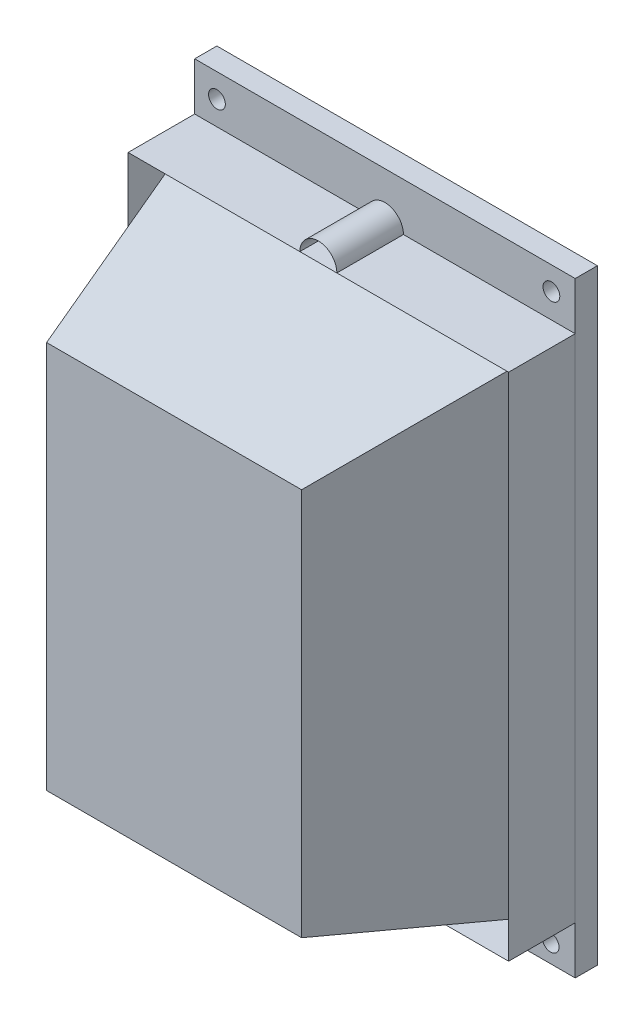
ISO-10303-21;
HEADER;
FILE_DESCRIPTION(('STEP AP214'),'2;1');
FILE_NAME('part.step','',(''),(''),'','','');
FILE_SCHEMA(('AUTOMOTIVE_DESIGN { 1 0 10303 214 1 1 1 1 }'));
ENDSEC;
DATA;
#1=APPLICATION_CONTEXT('core data for automotive mechanical design processes');
#2=APPLICATION_PROTOCOL_DEFINITION('international standard','automotive_design',2000,#1);
#3=PRODUCT_CONTEXT('',#1,'mechanical');
#4=PRODUCT('Part','Part','',(#3));
#5=PRODUCT_RELATED_PRODUCT_CATEGORY('part','',(#4));
#6=PRODUCT_DEFINITION_FORMATION('','',#4);
#7=PRODUCT_DEFINITION_CONTEXT('part definition',#1,'design');
#8=PRODUCT_DEFINITION('design','',#6,#7);
#9=PRODUCT_DEFINITION_SHAPE('','',#8);
#10=(LENGTH_UNIT() NAMED_UNIT(*) SI_UNIT(.MILLI.,.METRE.));
#11=(NAMED_UNIT(*) PLANE_ANGLE_UNIT() SI_UNIT($,.RADIAN.));
#12=(NAMED_UNIT(*) SI_UNIT($,.STERADIAN.) SOLID_ANGLE_UNIT());
#13=UNCERTAINTY_MEASURE_WITH_UNIT(LENGTH_MEASURE(1.E-05),#10,'distance_accuracy_value','');
#14=(GEOMETRIC_REPRESENTATION_CONTEXT(3) GLOBAL_UNCERTAINTY_ASSIGNED_CONTEXT((#13)) GLOBAL_UNIT_ASSIGNED_CONTEXT((#10,
#11,#12)) REPRESENTATION_CONTEXT('',''));
#15=CARTESIAN_POINT('',(0.,0.,0.));
#16=DIRECTION('',(0.,0.,1.));
#17=DIRECTION('',(1.,0.,0.));
#18=AXIS2_PLACEMENT_3D('',#15,#16,#17);
#19=CARTESIAN_POINT('',(-4.28663117251557,-5.74678858480512,0.5));
#20=DIRECTION('',(-1.,0.,0.));
#21=DIRECTION('',(0.,0.,1.));
#22=AXIS2_PLACEMENT_3D('',#19,#20,#21);
#23=PLANE('',#22);
#24=DIRECTION('',(0.,-1.,0.));
#25=VECTOR('',#24,1.);
#26=CARTESIAN_POINT('',(-4.28663117251557,-5.74678858480512,2.));
#27=LINE('',#26,#25);
#28=CARTESIAN_POINT('',(-4.28663117251557,5.74678858480512,2.));
#29=VERTEX_POINT('',#28);
#30=CARTESIAN_POINT('',(-4.28663117251557,-5.74678858480512,2.));
#31=VERTEX_POINT('',#30);
#32=EDGE_CURVE('E61',#29,#31,#27,.T.);
#33=ORIENTED_EDGE('',*,*,#32,.F.);
#34=DIRECTION('',(0.,0.,1.));
#35=VECTOR('',#34,1.);
#36=CARTESIAN_POINT('',(-4.28663117251557,5.74678858480512,0.5));
#37=LINE('',#36,#35);
#38=CARTESIAN_POINT('',(-4.28663117251557,5.74678858480512,0.5));
#39=VERTEX_POINT('',#38);
#40=EDGE_CURVE('E96',#39,#29,#37,.T.);
#41=ORIENTED_EDGE('',*,*,#40,.F.);
#42=DIRECTION('',(0.,-1.,0.));
#43=VECTOR('',#42,1.);
#44=CARTESIAN_POINT('',(-4.28663117251557,-5.74678858480512,0.5));
#45=LINE('',#44,#43);
#46=CARTESIAN_POINT('',(-4.28663117251557,-5.74678858480512,0.5));
#47=VERTEX_POINT('',#46);
#48=EDGE_CURVE('E12',#39,#47,#45,.T.);
#49=ORIENTED_EDGE('',*,*,#48,.T.);
#50=DIRECTION('',(0.,0.,1.));
#51=VECTOR('',#50,1.);
#52=CARTESIAN_POINT('',(-4.28663117251557,-5.74678858480512,0.5));
#53=LINE('',#52,#51);
#54=EDGE_CURVE('E70',#47,#31,#53,.T.);
#55=ORIENTED_EDGE('',*,*,#54,.T.);
#56=EDGE_LOOP('',(#33,#41,#49,#55));
#57=FACE_BOUND('',#56,.T.);
#58=ADVANCED_FACE('F53',(#57),#23,.T.);
#59=CARTESIAN_POINT('',(4.28663117251557,-5.74678858480512,0.5));
#60=DIRECTION('',(0.,-1.,0.));
#61=DIRECTION('',(0.,0.,-1.));
#62=AXIS2_PLACEMENT_3D('',#59,#60,#61);
#63=PLANE('',#62);
#64=DIRECTION('',(1.,0.,0.));
#65=VECTOR('',#64,1.);
#66=CARTESIAN_POINT('',(4.28663117251557,-5.74678858480512,2.));
#67=LINE('',#66,#65);
#68=CARTESIAN_POINT('',(4.28663117251557,-5.74678858480512,2.));
#69=VERTEX_POINT('',#68);
#70=EDGE_CURVE('E113',#31,#69,#67,.T.);
#71=ORIENTED_EDGE('',*,*,#70,.F.);
#72=ORIENTED_EDGE('',*,*,#54,.F.);
#73=DIRECTION('',(1.,0.,0.));
#74=VECTOR('',#73,1.);
#75=CARTESIAN_POINT('',(4.28663117251557,-5.74678858480512,0.5));
#76=LINE('',#75,#74);
#77=CARTESIAN_POINT('',(4.28663117251557,-5.74678858480512,0.5));
#78=VERTEX_POINT('',#77);
#79=EDGE_CURVE('E114',#47,#78,#76,.T.);
#80=ORIENTED_EDGE('',*,*,#79,.T.);
#81=DIRECTION('',(0.,0.,1.));
#82=VECTOR('',#81,1.);
#83=CARTESIAN_POINT('',(4.28663117251557,-5.74678858480512,0.5));
#84=LINE('',#83,#82);
#85=EDGE_CURVE('E84',#78,#69,#84,.T.);
#86=ORIENTED_EDGE('',*,*,#85,.T.);
#87=EDGE_LOOP('',(#71,#72,#80,#86));
#88=FACE_BOUND('',#87,.T.);
#89=ADVANCED_FACE('F140',(#88),#63,.T.);
#90=CARTESIAN_POINT('',(4.28663117251557,-5.74678858480512,0.5));
#91=DIRECTION('',(1.,0.,0.));
#92=DIRECTION('',(0.,0.,-1.));
#93=AXIS2_PLACEMENT_3D('',#90,#91,#92);
#94=PLANE('',#93);
#95=DIRECTION('',(0.,1.,0.));
#96=VECTOR('',#95,1.);
#97=CARTESIAN_POINT('',(4.28663117251557,-5.74678858480512,2.));
#98=LINE('',#97,#96);
#99=CARTESIAN_POINT('',(4.28663117251557,5.74678858480512,2.));
#100=VERTEX_POINT('',#99);
#101=EDGE_CURVE('E100',#69,#100,#98,.T.);
#102=ORIENTED_EDGE('',*,*,#101,.F.);
#103=ORIENTED_EDGE('',*,*,#85,.F.);
#104=DIRECTION('',(0.,1.,0.));
#105=VECTOR('',#104,1.);
#106=CARTESIAN_POINT('',(4.28663117251557,-5.74678858480512,0.5));
#107=LINE('',#106,#105);
#108=CARTESIAN_POINT('',(4.28663117251557,5.74678858480512,0.5));
#109=VERTEX_POINT('',#108);
#110=EDGE_CURVE('E111',#78,#109,#107,.T.);
#111=ORIENTED_EDGE('',*,*,#110,.T.);
#112=DIRECTION('',(0.,0.,1.));
#113=VECTOR('',#112,1.);
#114=CARTESIAN_POINT('',(4.28663117251557,5.74678858480512,0.5));
#115=LINE('',#114,#113);
#116=EDGE_CURVE('E55',#109,#100,#115,.T.);
#117=ORIENTED_EDGE('',*,*,#116,.T.);
#118=EDGE_LOOP('',(#102,#103,#111,#117));
#119=FACE_BOUND('',#118,.T.);
#120=ADVANCED_FACE('F142',(#119),#94,.T.);
#121=CARTESIAN_POINT('',(4.28663117251557,5.74678858480512,0.5));
#122=DIRECTION('',(0.,1.,0.));
#123=DIRECTION('',(0.,0.,1.));
#124=AXIS2_PLACEMENT_3D('',#121,#122,#123);
#125=PLANE('',#124);
#126=DIRECTION('',(-1.,0.,0.));
#127=VECTOR('',#126,1.);
#128=CARTESIAN_POINT('',(4.28663117251557,5.74678858480512,2.));
#129=LINE('',#128,#127);
#130=EDGE_CURVE('E109',#100,#29,#129,.T.);
#131=ORIENTED_EDGE('',*,*,#130,.F.);
#132=ORIENTED_EDGE('',*,*,#116,.F.);
#133=DIRECTION('',(-1.,0.,0.));
#134=VECTOR('',#133,1.);
#135=CARTESIAN_POINT('',(4.28663117251557,5.74678858480512,0.5));
#136=LINE('',#135,#134);
#137=EDGE_CURVE('E101',#109,#39,#136,.T.);
#138=ORIENTED_EDGE('',*,*,#137,.T.);
#139=ORIENTED_EDGE('',*,*,#40,.T.);
#140=EDGE_LOOP('',(#131,#132,#138,#139));
#141=FACE_BOUND('',#140,.T.);
#142=ADVANCED_FACE('F102',(#141),#125,.T.);
#143=OPEN_SHELL('',(#58,#89,#120,#142));
#144=SHELL_BASED_SURFACE_MODEL('B2',(#143));
#145=CARTESIAN_POINT('',(0.,5.74678858480512,0.5));
#146=DIRECTION('',(0.,0.,1.));
#147=DIRECTION('',(1.,0.,0.));
#148=AXIS2_PLACEMENT_3D('',#145,#146,#147);
#149=CYLINDRICAL_SURFACE('',#148,0.416715703548174);
#150=CARTESIAN_POINT('',(0.,5.74678858480512,2.));
#151=DIRECTION('',(0.,0.,1.));
#152=DIRECTION('',(1.,0.,0.));
#153=AXIS2_PLACEMENT_3D('',#150,#151,#152);
#154=CIRCLE('',#153,0.416715703548174);
#155=CARTESIAN_POINT('',(0.416715703548174,5.74678858480512,2.));
#156=VERTEX_POINT('',#155);
#157=CARTESIAN_POINT('',(-0.416715703548174,5.74678858480512,2.));
#158=VERTEX_POINT('',#157);
#159=EDGE_CURVE('E223',#156,#158,#154,.T.);
#160=ORIENTED_EDGE('',*,*,#159,.F.);
#161=DIRECTION('',(0.,0.,1.));
#162=VECTOR('',#161,1.);
#163=CARTESIAN_POINT('',(0.416715703548174,5.74678858480512,0.5));
#164=LINE('',#163,#162);
#165=CARTESIAN_POINT('',(0.416715703548174,5.74678858480512,0.5));
#166=VERTEX_POINT('',#165);
#167=EDGE_CURVE('E205',#166,#156,#164,.T.);
#168=ORIENTED_EDGE('',*,*,#167,.F.);
#169=CARTESIAN_POINT('',(0.,5.74678858480512,0.5));
#170=DIRECTION('',(0.,0.,1.));
#171=DIRECTION('',(1.,0.,0.));
#172=AXIS2_PLACEMENT_3D('',#169,#170,#171);
#173=CIRCLE('',#172,0.416715703548174);
#174=CARTESIAN_POINT('',(-0.416715703548174,5.74678858480512,0.5));
#175=VERTEX_POINT('',#174);
#176=EDGE_CURVE('E211',#166,#175,#173,.T.);
#177=ORIENTED_EDGE('',*,*,#176,.T.);
#178=DIRECTION('',(0.,0.,1.));
#179=VECTOR('',#178,1.);
#180=CARTESIAN_POINT('',(-0.416715703548174,5.74678858480512,0.5));
#181=LINE('',#180,#179);
#182=EDGE_CURVE('E51',#175,#158,#181,.T.);
#183=ORIENTED_EDGE('',*,*,#182,.T.);
#184=EDGE_LOOP('',(#160,#168,#177,#183));
#185=FACE_BOUND('',#184,.T.);
#186=ADVANCED_FACE('F204',(#185),#149,.T.);
#187=OPEN_SHELL('',(#186));
#188=SHELL_BASED_SURFACE_MODEL('B6',(#187));
#189=CARTESIAN_POINT('',(0.,-5.74678858480512,0.5));
#190=DIRECTION('',(0.,0.,1.));
#191=DIRECTION('',(1.,0.,0.));
#192=AXIS2_PLACEMENT_3D('',#189,#190,#191);
#193=CYLINDRICAL_SURFACE('',#192,0.41625);
#194=CARTESIAN_POINT('',(0.,-5.74678858480512,2.));
#195=DIRECTION('',(0.,0.,1.));
#196=DIRECTION('',(1.,0.,0.));
#197=AXIS2_PLACEMENT_3D('',#194,#195,#196);
#198=CIRCLE('',#197,0.41625);
#199=CARTESIAN_POINT('',(-0.41625,-5.74678858480512,2.));
#200=VERTEX_POINT('',#199);
#201=CARTESIAN_POINT('',(0.41625,-5.74678858480512,2.));
#202=VERTEX_POINT('',#201);
#203=EDGE_CURVE('E279',#200,#202,#198,.T.);
#204=ORIENTED_EDGE('',*,*,#203,.F.);
#205=DIRECTION('',(0.,0.,1.));
#206=VECTOR('',#205,1.);
#207=CARTESIAN_POINT('',(-0.41625,-5.74678858480512,0.5));
#208=LINE('',#207,#206);
#209=CARTESIAN_POINT('',(-0.41625,-5.74678858480512,0.5));
#210=VERTEX_POINT('',#209);
#211=EDGE_CURVE('E261',#210,#200,#208,.T.);
#212=ORIENTED_EDGE('',*,*,#211,.F.);
#213=CARTESIAN_POINT('',(0.,-5.74678858480512,0.5));
#214=DIRECTION('',(0.,0.,1.));
#215=DIRECTION('',(1.,0.,0.));
#216=AXIS2_PLACEMENT_3D('',#213,#214,#215);
#217=CIRCLE('',#216,0.41625);
#218=CARTESIAN_POINT('',(0.41625,-5.74678858480512,0.5));
#219=VERTEX_POINT('',#218);
#220=EDGE_CURVE('E267',#210,#219,#217,.T.);
#221=ORIENTED_EDGE('',*,*,#220,.T.);
#222=DIRECTION('',(0.,0.,1.));
#223=VECTOR('',#222,1.);
#224=CARTESIAN_POINT('',(0.41625,-5.74678858480512,0.5));
#225=LINE('',#224,#223);
#226=EDGE_CURVE('E202',#219,#202,#225,.T.);
#227=ORIENTED_EDGE('',*,*,#226,.T.);
#228=EDGE_LOOP('',(#204,#212,#221,#227));
#229=FACE_BOUND('',#228,.T.);
#230=ADVANCED_FACE('F260',(#229),#193,.T.);
#231=OPEN_SHELL('',(#230));
#232=SHELL_BASED_SURFACE_MODEL('B45',(#231));
#233=CARTESIAN_POINT('',(-4.28663117251557,-6.82361696849417,0.5));
#234=DIRECTION('',(1.,0.,0.));
#235=DIRECTION('',(0.,0.,-1.));
#236=AXIS2_PLACEMENT_3D('',#233,#234,#235);
#237=PLANE('',#236);
#238=DIRECTION('',(0.,-1.,0.));
#239=VECTOR('',#238,1.);
#240=CARTESIAN_POINT('',(-4.28663117251557,-6.82361696849417,0.));
#241=LINE('',#240,#239);
#242=CARTESIAN_POINT('',(-4.28663117251557,6.82361696849417,0.));
#243=VERTEX_POINT('',#242);
#244=CARTESIAN_POINT('',(-4.28663117251557,-6.82361696849417,0.));
#245=VERTEX_POINT('',#244);
#246=EDGE_CURVE('E389',#243,#245,#241,.T.);
#247=ORIENTED_EDGE('',*,*,#246,.T.);
#248=DIRECTION('',(0.,0.,-1.));
#249=VECTOR('',#248,1.);
#250=CARTESIAN_POINT('',(-4.28663117251557,-6.82361696849417,0.5));
#251=LINE('',#250,#249);
#252=CARTESIAN_POINT('',(-4.28663117251557,-6.82361696849417,0.5));
#253=VERTEX_POINT('',#252);
#254=EDGE_CURVE('E258',#253,#245,#251,.T.);
#255=ORIENTED_EDGE('',*,*,#254,.F.);
#256=DIRECTION('',(0.,-1.,0.));
#257=VECTOR('',#256,1.);
#258=CARTESIAN_POINT('',(-4.28663117251557,-6.82361696849417,0.5));
#259=LINE('',#258,#257);
#260=CARTESIAN_POINT('',(-4.28663117251557,6.82361696849417,0.5));
#261=VERTEX_POINT('',#260);
#262=EDGE_CURVE('E403',#261,#253,#259,.T.);
#263=ORIENTED_EDGE('',*,*,#262,.F.);
#264=DIRECTION('',(0.,0.,-1.));
#265=VECTOR('',#264,1.);
#266=CARTESIAN_POINT('',(-4.28663117251557,6.82361696849417,0.5));
#267=LINE('',#266,#265);
#268=EDGE_CURVE('E413',#261,#243,#267,.T.);
#269=ORIENTED_EDGE('',*,*,#268,.T.);
#270=EDGE_LOOP('',(#247,#255,#263,#269));
#271=FACE_BOUND('',#270,.T.);
#272=ADVANCED_FACE('F307',(#271),#237,.F.);
#273=CARTESIAN_POINT('',(4.28663117251557,-6.82361696849417,0.5));
#274=DIRECTION('',(0.,1.,0.));
#275=DIRECTION('',(0.,0.,1.));
#276=AXIS2_PLACEMENT_3D('',#273,#274,#275);
#277=PLANE('',#276);
#278=DIRECTION('',(1.,0.,0.));
#279=VECTOR('',#278,1.);
#280=CARTESIAN_POINT('',(4.28663117251557,-6.82361696849417,0.));
#281=LINE('',#280,#279);
#282=CARTESIAN_POINT('',(4.28663117251557,-6.82361696849417,0.));
#283=VERTEX_POINT('',#282);
#284=EDGE_CURVE('E416',#245,#283,#281,.T.);
#285=ORIENTED_EDGE('',*,*,#284,.T.);
#286=DIRECTION('',(0.,0.,-1.));
#287=VECTOR('',#286,1.);
#288=CARTESIAN_POINT('',(4.28663117251557,-6.82361696849417,0.5));
#289=LINE('',#288,#287);
#290=CARTESIAN_POINT('',(4.28663117251557,-6.82361696849417,0.5));
#291=VERTEX_POINT('',#290);
#292=EDGE_CURVE('E314',#291,#283,#289,.T.);
#293=ORIENTED_EDGE('',*,*,#292,.F.);
#294=DIRECTION('',(1.,0.,0.));
#295=VECTOR('',#294,1.);
#296=CARTESIAN_POINT('',(4.28663117251557,-6.82361696849417,0.5));
#297=LINE('',#296,#295);
#298=EDGE_CURVE('E406',#253,#291,#297,.T.);
#299=ORIENTED_EDGE('',*,*,#298,.F.);
#300=ORIENTED_EDGE('',*,*,#254,.T.);
#301=EDGE_LOOP('',(#285,#293,#299,#300));
#302=FACE_BOUND('',#301,.T.);
#303=ADVANCED_FACE('F444',(#302),#277,.F.);
#304=CARTESIAN_POINT('',(4.28663117251557,-6.82361696849417,0.5));
#305=DIRECTION('',(-1.,0.,0.));
#306=DIRECTION('',(0.,0.,1.));
#307=AXIS2_PLACEMENT_3D('',#304,#305,#306);
#308=PLANE('',#307);
#309=DIRECTION('',(0.,1.,0.));
#310=VECTOR('',#309,1.);
#311=CARTESIAN_POINT('',(4.28663117251557,-6.82361696849417,0.));
#312=LINE('',#311,#310);
#313=CARTESIAN_POINT('',(4.28663117251557,6.82361696849417,0.));
#314=VERTEX_POINT('',#313);
#315=EDGE_CURVE('E418',#283,#314,#312,.T.);
#316=ORIENTED_EDGE('',*,*,#315,.T.);
#317=DIRECTION('',(0.,0.,-1.));
#318=VECTOR('',#317,1.);
#319=CARTESIAN_POINT('',(4.28663117251557,6.82361696849417,0.5));
#320=LINE('',#319,#318);
#321=CARTESIAN_POINT('',(4.28663117251557,6.82361696849417,0.5));
#322=VERTEX_POINT('',#321);
#323=EDGE_CURVE('E423',#322,#314,#320,.T.);
#324=ORIENTED_EDGE('',*,*,#323,.F.);
#325=DIRECTION('',(0.,1.,0.));
#326=VECTOR('',#325,1.);
#327=CARTESIAN_POINT('',(4.28663117251557,-6.82361696849417,0.5));
#328=LINE('',#327,#326);
#329=EDGE_CURVE('E409',#291,#322,#328,.T.);
#330=ORIENTED_EDGE('',*,*,#329,.F.);
#331=ORIENTED_EDGE('',*,*,#292,.T.);
#332=EDGE_LOOP('',(#316,#324,#330,#331));
#333=FACE_BOUND('',#332,.T.);
#334=ADVANCED_FACE('F430',(#333),#308,.F.);
#335=CARTESIAN_POINT('',(4.28663117251557,6.82361696849417,0.5));
#336=DIRECTION('',(0.,-1.,0.));
#337=DIRECTION('',(0.,0.,-1.));
#338=AXIS2_PLACEMENT_3D('',#335,#336,#337);
#339=PLANE('',#338);
#340=DIRECTION('',(-1.,0.,0.));
#341=VECTOR('',#340,1.);
#342=CARTESIAN_POINT('',(4.28663117251557,6.82361696849417,0.));
#343=LINE('',#342,#341);
#344=EDGE_CURVE('E407',#314,#243,#343,.T.);
#345=ORIENTED_EDGE('',*,*,#344,.T.);
#346=ORIENTED_EDGE('',*,*,#268,.F.);
#347=DIRECTION('',(-1.,0.,0.));
#348=VECTOR('',#347,1.);
#349=CARTESIAN_POINT('',(4.28663117251557,6.82361696849417,0.5));
#350=LINE('',#349,#348);
#351=EDGE_CURVE('E411',#322,#261,#350,.T.);
#352=ORIENTED_EDGE('',*,*,#351,.F.);
#353=ORIENTED_EDGE('',*,*,#323,.T.);
#354=EDGE_LOOP('',(#345,#346,#352,#353));
#355=FACE_BOUND('',#354,.T.);
#356=ADVANCED_FACE('F439',(#355),#339,.F.);
#357=CARTESIAN_POINT('',(0.,0.,0.5));
#358=DIRECTION('',(0.,0.,1.));
#359=DIRECTION('',(1.,0.,0.));
#360=AXIS2_PLACEMENT_3D('',#357,#358,#359);
#361=PLANE('',#360);
#362=CARTESIAN_POINT('',(3.75017019431391,6.30236935433309,0.5));
#363=DIRECTION('',(0.,0.,1.));
#364=DIRECTION('',(1.,0.,0.));
#365=AXIS2_PLACEMENT_3D('',#362,#363,#364);
#366=CIRCLE('',#365,0.188912499999999);
#367=CARTESIAN_POINT('',(3.93908269431391,6.30236935433309,0.5));
#368=VERTEX_POINT('',#367);
#369=EDGE_CURVE('E498',#368,#368,#366,.T.);
#370=ORIENTED_EDGE('',*,*,#369,.F.);
#371=EDGE_LOOP('',(#370));
#372=FACE_BOUND('',#371,.T.);
#373=CARTESIAN_POINT('',(-3.78489399240941,6.28500745528534,0.5));
#374=DIRECTION('',(0.,0.,1.));
#375=DIRECTION('',(1.,0.,0.));
#376=AXIS2_PLACEMENT_3D('',#373,#374,#375);
#377=CIRCLE('',#376,0.1889125);
#378=CARTESIAN_POINT('',(-3.59598149240941,6.28500745528534,0.5));
#379=VERTEX_POINT('',#378);
#380=EDGE_CURVE('E502',#379,#379,#377,.T.);
#381=ORIENTED_EDGE('',*,*,#380,.F.);
#382=EDGE_LOOP('',(#381));
#383=FACE_BOUND('',#382,.T.);
#384=CARTESIAN_POINT('',(-3.87170348764816,-6.42390264766737,0.5));
#385=DIRECTION('',(0.,0.,1.));
#386=DIRECTION('',(1.,0.,0.));
#387=AXIS2_PLACEMENT_3D('',#384,#385,#386);
#388=CIRCLE('',#387,0.1889125);
#389=CARTESIAN_POINT('',(-3.68279098764816,-6.42390264766737,0.5));
#390=VERTEX_POINT('',#389);
#391=EDGE_CURVE('E511',#390,#390,#388,.T.);
#392=ORIENTED_EDGE('',*,*,#391,.F.);
#393=EDGE_LOOP('',(#392));
#394=FACE_BOUND('',#393,.T.);
#395=CARTESIAN_POINT('',(3.73280829526617,-6.40654074861962,0.5));
#396=DIRECTION('',(0.,0.,1.));
#397=DIRECTION('',(1.,0.,0.));
#398=AXIS2_PLACEMENT_3D('',#395,#396,#397);
#399=CIRCLE('',#398,0.188912499999999);
#400=CARTESIAN_POINT('',(3.92172079526617,-6.40654074861962,0.5));
#401=VERTEX_POINT('',#400);
#402=EDGE_CURVE('E517',#401,#401,#399,.T.);
#403=ORIENTED_EDGE('',*,*,#402,.F.);
#404=EDGE_LOOP('',(#403));
#405=FACE_BOUND('',#404,.T.);
#406=DIRECTION('',(0.,-1.,0.));
#407=VECTOR('',#406,1.);
#408=CARTESIAN_POINT('',(-4.14525298583523,-5.64309754513559,0.5));
#409=LINE('',#408,#407);
#410=CARTESIAN_POINT('',(-4.14525298583523,5.64309754513559,0.5));
#411=VERTEX_POINT('',#410);
#412=CARTESIAN_POINT('',(-4.14525298583523,-5.64309754513559,0.5));
#413=VERTEX_POINT('',#412);
#414=EDGE_CURVE('E321',#411,#413,#409,.T.);
#415=ORIENTED_EDGE('',*,*,#414,.F.);
#416=DIRECTION('',(-1.,0.,0.));
#417=VECTOR('',#416,1.);
#418=CARTESIAN_POINT('',(4.14525298583523,5.64309754513559,0.5));
#419=LINE('',#418,#417);
#420=CARTESIAN_POINT('',(4.14525298583523,5.64309754513559,0.5));
#421=VERTEX_POINT('',#420);
#422=EDGE_CURVE('E325',#421,#411,#419,.T.);
#423=ORIENTED_EDGE('',*,*,#422,.F.);
#424=DIRECTION('',(0.,1.,0.));
#425=VECTOR('',#424,1.);
#426=CARTESIAN_POINT('',(4.14525298583523,-5.64309754513559,0.5));
#427=LINE('',#426,#425);
#428=CARTESIAN_POINT('',(4.14525298583523,-5.64309754513559,0.5));
#429=VERTEX_POINT('',#428);
#430=EDGE_CURVE('E366',#429,#421,#427,.T.);
#431=ORIENTED_EDGE('',*,*,#430,.F.);
#432=DIRECTION('',(1.,0.,0.));
#433=VECTOR('',#432,1.);
#434=CARTESIAN_POINT('',(4.14525298583523,-5.64309754513559,0.5));
#435=LINE('',#434,#433);
#436=EDGE_CURVE('E370',#413,#429,#435,.T.);
#437=ORIENTED_EDGE('',*,*,#436,.F.);
#438=EDGE_LOOP('',(#415,#423,#431,#437));
#439=FACE_BOUND('',#438,.T.);
#440=ORIENTED_EDGE('',*,*,#262,.T.);
#441=ORIENTED_EDGE('',*,*,#298,.T.);
#442=ORIENTED_EDGE('',*,*,#329,.T.);
#443=ORIENTED_EDGE('',*,*,#351,.T.);
#444=EDGE_LOOP('',(#440,#441,#442,#443));
#445=FACE_BOUND('',#444,.T.);
#446=ADVANCED_FACE('F368',(#372,#383,#394,#405,#439,#445),#361,.T.);
#447=CARTESIAN_POINT('',(0.,0.,0.));
#448=DIRECTION('',(0.,0.,1.));
#449=DIRECTION('',(1.,0.,0.));
#450=AXIS2_PLACEMENT_3D('',#447,#448,#449);
#451=PLANE('',#450);
#452=CARTESIAN_POINT('',(3.75017019431391,6.30236935433309,0.));
#453=DIRECTION('',(0.,0.,1.));
#454=DIRECTION('',(1.,0.,0.));
#455=AXIS2_PLACEMENT_3D('',#452,#453,#454);
#456=CIRCLE('',#455,0.188912499999999);
#457=CARTESIAN_POINT('',(3.93908269431391,6.30236935433309,0.));
#458=VERTEX_POINT('',#457);
#459=EDGE_CURVE('E501',#458,#458,#456,.T.);
#460=ORIENTED_EDGE('',*,*,#459,.T.);
#461=EDGE_LOOP('',(#460));
#462=FACE_BOUND('',#461,.T.);
#463=CARTESIAN_POINT('',(-3.78489399240941,6.28500745528534,0.));
#464=DIRECTION('',(0.,0.,1.));
#465=DIRECTION('',(1.,0.,0.));
#466=AXIS2_PLACEMENT_3D('',#463,#464,#465);
#467=CIRCLE('',#466,0.188912499999999);
#468=CARTESIAN_POINT('',(-3.59598149240942,6.28500745528534,0.));
#469=VERTEX_POINT('',#468);
#470=EDGE_CURVE('E505',#469,#469,#467,.T.);
#471=ORIENTED_EDGE('',*,*,#470,.T.);
#472=EDGE_LOOP('',(#471));
#473=FACE_BOUND('',#472,.T.);
#474=CARTESIAN_POINT('',(-3.87170348764816,-6.42390264766737,0.));
#475=DIRECTION('',(0.,0.,1.));
#476=DIRECTION('',(1.,0.,0.));
#477=AXIS2_PLACEMENT_3D('',#474,#475,#476);
#478=CIRCLE('',#477,0.188912499999999);
#479=CARTESIAN_POINT('',(-3.68279098764816,-6.42390264766737,0.));
#480=VERTEX_POINT('',#479);
#481=EDGE_CURVE('E514',#480,#480,#478,.T.);
#482=ORIENTED_EDGE('',*,*,#481,.T.);
#483=EDGE_LOOP('',(#482));
#484=FACE_BOUND('',#483,.T.);
#485=CARTESIAN_POINT('',(3.73280829526617,-6.40654074861962,0.));
#486=DIRECTION('',(0.,0.,1.));
#487=DIRECTION('',(1.,0.,0.));
#488=AXIS2_PLACEMENT_3D('',#485,#486,#487);
#489=CIRCLE('',#488,0.188912499999999);
#490=CARTESIAN_POINT('',(3.92172079526617,-6.40654074861962,0.));
#491=VERTEX_POINT('',#490);
#492=EDGE_CURVE('E520',#491,#491,#489,.T.);
#493=ORIENTED_EDGE('',*,*,#492,.T.);
#494=EDGE_LOOP('',(#493));
#495=FACE_BOUND('',#494,.T.);
#496=ORIENTED_EDGE('',*,*,#246,.F.);
#497=ORIENTED_EDGE('',*,*,#344,.F.);
#498=ORIENTED_EDGE('',*,*,#315,.F.);
#499=ORIENTED_EDGE('',*,*,#284,.F.);
#500=EDGE_LOOP('',(#496,#497,#498,#499));
#501=FACE_BOUND('',#500,.T.);
#502=ADVANCED_FACE('F436',(#462,#473,#484,#495,#501),#451,.F.);
#503=CARTESIAN_POINT('',(-4.14525298583523,-5.64309754513559,0.5));
#504=DIRECTION('',(-0.965925826289068,0.,0.258819045102521));
#505=DIRECTION('',(0.258819045102521,0.,0.965925826289068));
#506=AXIS2_PLACEMENT_3D('',#503,#504,#505);
#507=PLANE('',#506);
#508=ORIENTED_EDGE('',*,*,#414,.T.);
#509=DIRECTION('',(-0.250562807085732,-0.250562807085732,-0.935113126531029));
#510=VECTOR('',#509,1.);
#511=CARTESIAN_POINT('',(-3.62476075882043,-5.12260531812079,2.44250343616392));
#512=LINE('',#511,#510);
#513=CARTESIAN_POINT('',(-2.8724943217874,-4.37033888108776,5.25));
#514=VERTEX_POINT('',#513);
#515=EDGE_CURVE('E383',#514,#413,#512,.T.);
#516=ORIENTED_EDGE('',*,*,#515,.F.);
#517=DIRECTION('',(0.,1.,0.));
#518=VECTOR('',#517,1.);
#519=CARTESIAN_POINT('',(-2.8724943217874,-5.64309754513559,5.25));
#520=LINE('',#519,#518);
#521=CARTESIAN_POINT('',(-2.8724943217874,4.37033888108776,5.25));
#522=VERTEX_POINT('',#521);
#523=EDGE_CURVE('E395',#522,#514,#520,.F.);
#524=ORIENTED_EDGE('',*,*,#523,.F.);
#525=DIRECTION('',(-0.250562807085732,0.250562807085732,-0.935113126531029));
#526=VECTOR('',#525,1.);
#527=CARTESIAN_POINT('',(-3.43668624248662,4.93453080178698,3.14440708673064));
#528=LINE('',#527,#526);
#529=EDGE_CURVE('E391',#522,#411,#528,.T.);
#530=ORIENTED_EDGE('',*,*,#529,.T.);
#531=EDGE_LOOP('',(#508,#516,#524,#530));
#532=FACE_BOUND('',#531,.T.);
#533=ADVANCED_FACE('F458',(#532),#507,.T.);
#534=CARTESIAN_POINT('',(4.14525298583523,-5.64309754513559,0.5));
#535=DIRECTION('',(0.,-0.965925826289068,0.258819045102521));
#536=DIRECTION('',(0.,-0.258819045102521,-0.965925826289068));
#537=AXIS2_PLACEMENT_3D('',#534,#535,#536);
#538=PLANE('',#537);
#539=ORIENTED_EDGE('',*,*,#436,.T.);
#540=DIRECTION('',(0.250562807085732,-0.250562807085732,-0.935113126531029));
#541=VECTOR('',#540,1.);
#542=CARTESIAN_POINT('',(4.14525298583523,-5.64309754513559,0.5));
#543=LINE('',#542,#541);
#544=CARTESIAN_POINT('',(2.8724943217874,-4.37033888108776,5.25));
#545=VERTEX_POINT('',#544);
#546=EDGE_CURVE('E380',#545,#429,#543,.T.);
#547=ORIENTED_EDGE('',*,*,#546,.F.);
#548=DIRECTION('',(-1.,0.,0.));
#549=VECTOR('',#548,1.);
#550=CARTESIAN_POINT('',(4.14525298583523,-4.37033888108776,5.25));
#551=LINE('',#550,#549);
#552=EDGE_CURVE('E398',#514,#545,#551,.F.);
#553=ORIENTED_EDGE('',*,*,#552,.F.);
#554=ORIENTED_EDGE('',*,*,#515,.T.);
#555=EDGE_LOOP('',(#539,#547,#553,#554));
#556=FACE_BOUND('',#555,.T.);
#557=ADVANCED_FACE('F379',(#556),#538,.T.);
#558=CARTESIAN_POINT('',(4.14525298583523,-5.64309754513559,0.5));
#559=DIRECTION('',(0.965925826289068,0.,0.258819045102521));
#560=DIRECTION('',(0.258819045102521,0.,-0.965925826289068));
#561=AXIS2_PLACEMENT_3D('',#558,#559,#560);
#562=PLANE('',#561);
#563=ORIENTED_EDGE('',*,*,#430,.T.);
#564=DIRECTION('',(0.250562807085732,0.250562807085732,-0.935113126531029));
#565=VECTOR('',#564,1.);
#566=CARTESIAN_POINT('',(4.14525298583523,5.64309754513559,0.5));
#567=LINE('',#566,#565);
#568=CARTESIAN_POINT('',(2.8724943217874,4.37033888108776,5.25));
#569=VERTEX_POINT('',#568);
#570=EDGE_CURVE('E387',#569,#421,#567,.T.);
#571=ORIENTED_EDGE('',*,*,#570,.F.);
#572=DIRECTION('',(0.,-1.,0.));
#573=VECTOR('',#572,1.);
#574=CARTESIAN_POINT('',(2.8724943217874,-5.64309754513559,5.25));
#575=LINE('',#574,#573);
#576=EDGE_CURVE('E386',#545,#569,#575,.F.);
#577=ORIENTED_EDGE('',*,*,#576,.F.);
#578=ORIENTED_EDGE('',*,*,#546,.T.);
#579=EDGE_LOOP('',(#563,#571,#577,#578));
#580=FACE_BOUND('',#579,.T.);
#581=ADVANCED_FACE('F385',(#580),#562,.T.);
#582=CARTESIAN_POINT('',(4.14525298583523,5.64309754513559,0.5));
#583=DIRECTION('',(0.,0.965925826289068,0.258819045102521));
#584=DIRECTION('',(0.,-0.258819045102521,0.965925826289068));
#585=AXIS2_PLACEMENT_3D('',#582,#583,#584);
#586=PLANE('',#585);
#587=ORIENTED_EDGE('',*,*,#422,.T.);
#588=ORIENTED_EDGE('',*,*,#529,.F.);
#589=DIRECTION('',(1.,0.,0.));
#590=VECTOR('',#589,1.);
#591=CARTESIAN_POINT('',(4.14525298583523,4.37033888108776,5.25));
#592=LINE('',#591,#590);
#593=EDGE_CURVE('E401',#569,#522,#592,.F.);
#594=ORIENTED_EDGE('',*,*,#593,.F.);
#595=ORIENTED_EDGE('',*,*,#570,.T.);
#596=EDGE_LOOP('',(#587,#588,#594,#595));
#597=FACE_BOUND('',#596,.T.);
#598=ADVANCED_FACE('F467',(#597),#586,.T.);
#599=CARTESIAN_POINT('',(0.,0.,5.25));
#600=DIRECTION('',(0.,0.,1.));
#601=DIRECTION('',(1.,0.,0.));
#602=AXIS2_PLACEMENT_3D('',#599,#600,#601);
#603=PLANE('',#602);
#604=ORIENTED_EDGE('',*,*,#523,.T.);
#605=ORIENTED_EDGE('',*,*,#552,.T.);
#606=ORIENTED_EDGE('',*,*,#576,.T.);
#607=ORIENTED_EDGE('',*,*,#593,.T.);
#608=EDGE_LOOP('',(#604,#605,#606,#607));
#609=FACE_BOUND('',#608,.T.);
#610=ADVANCED_FACE('F470',(#609),#603,.T.);
#611=CARTESIAN_POINT('',(3.73280829526617,-6.40654074861962,0.5));
#612=DIRECTION('',(0.,0.,1.));
#613=DIRECTION('',(1.,0.,0.));
#614=AXIS2_PLACEMENT_3D('',#611,#612,#613);
#615=CYLINDRICAL_SURFACE('',#614,0.188912499999999);
#616=ORIENTED_EDGE('',*,*,#402,.T.);
#617=EDGE_LOOP('',(#616));
#618=FACE_BOUND('',#617,.T.);
#619=ORIENTED_EDGE('',*,*,#492,.F.);
#620=EDGE_LOOP('',(#619));
#621=FACE_BOUND('',#620,.T.);
#622=ADVANCED_FACE('F477',(#618,#621),#615,.F.);
#623=CARTESIAN_POINT('',(-3.87170348764816,-6.42390264766737,0.5));
#624=DIRECTION('',(0.,0.,1.));
#625=DIRECTION('',(1.,0.,0.));
#626=AXIS2_PLACEMENT_3D('',#623,#624,#625);
#627=CYLINDRICAL_SURFACE('',#626,0.188912499999999);
#628=ORIENTED_EDGE('',*,*,#391,.T.);
#629=EDGE_LOOP('',(#628));
#630=FACE_BOUND('',#629,.T.);
#631=ORIENTED_EDGE('',*,*,#481,.F.);
#632=EDGE_LOOP('',(#631));
#633=FACE_BOUND('',#632,.T.);
#634=ADVANCED_FACE('F481',(#630,#633),#627,.F.);
#635=CARTESIAN_POINT('',(-3.78489399240941,6.28500745528534,0.5));
#636=DIRECTION('',(0.,0.,1.));
#637=DIRECTION('',(1.,0.,0.));
#638=AXIS2_PLACEMENT_3D('',#635,#636,#637);
#639=CYLINDRICAL_SURFACE('',#638,0.188912499999999);
#640=ORIENTED_EDGE('',*,*,#380,.T.);
#641=EDGE_LOOP('',(#640));
#642=FACE_BOUND('',#641,.T.);
#643=ORIENTED_EDGE('',*,*,#470,.F.);
#644=EDGE_LOOP('',(#643));
#645=FACE_BOUND('',#644,.T.);
#646=ADVANCED_FACE('F485',(#642,#645),#639,.F.);
#647=CARTESIAN_POINT('',(3.75017019431391,6.30236935433309,0.5));
#648=DIRECTION('',(0.,0.,1.));
#649=DIRECTION('',(1.,0.,0.));
#650=AXIS2_PLACEMENT_3D('',#647,#648,#649);
#651=CYLINDRICAL_SURFACE('',#650,0.188912499999999);
#652=ORIENTED_EDGE('',*,*,#369,.T.);
#653=EDGE_LOOP('',(#652));
#654=FACE_BOUND('',#653,.T.);
#655=ORIENTED_EDGE('',*,*,#459,.F.);
#656=EDGE_LOOP('',(#655));
#657=FACE_BOUND('',#656,.T.);
#658=ADVANCED_FACE('F489',(#654,#657),#651,.F.);
#659=CLOSED_SHELL('',(#272,#303,#334,#356,#446,#502,#533,#557,#581,#598,#610,#622,#634,#646,#658));
#660=MANIFOLD_SOLID_BREP('B196',#659);
#661=ADVANCED_BREP_SHAPE_REPRESENTATION('',(#18,#660),#14);
#662=MANIFOLD_SURFACE_SHAPE_REPRESENTATION('',(#18,#144,#188,#232),#14);
#663=SHAPE_REPRESENTATION('',(#18),#14);
#664=SHAPE_DEFINITION_REPRESENTATION(#9,#663);
#665=SHAPE_REPRESENTATION_RELATIONSHIP('','',#663,#661);
#666=SHAPE_REPRESENTATION_RELATIONSHIP('','',#663,#662);
ENDSEC;
END-ISO-10303-21;
